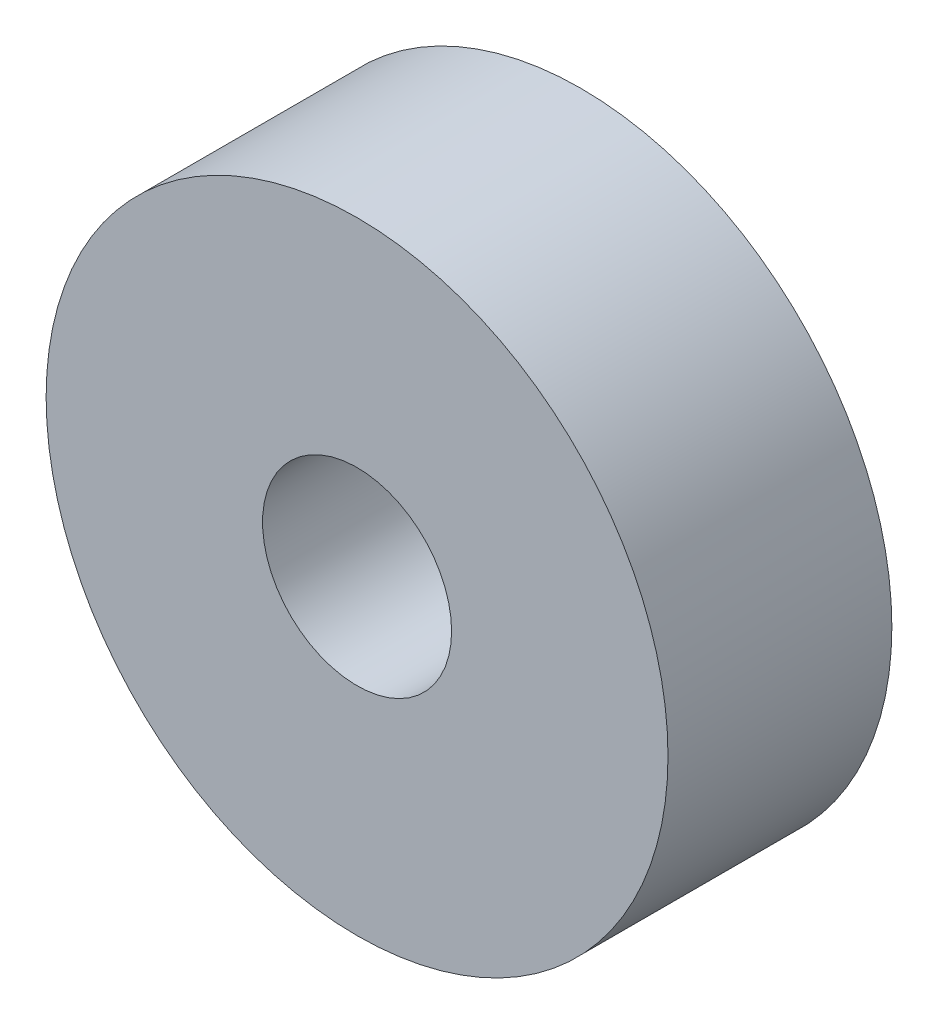
ISO-10303-21;
HEADER;
FILE_DESCRIPTION(('STEP AP214'),'2;1');
FILE_NAME('part.step','',(''),(''),'','','');
FILE_SCHEMA(('AUTOMOTIVE_DESIGN { 1 0 10303 214 1 1 1 1 }'));
ENDSEC;
DATA;
#1=APPLICATION_CONTEXT('core data for automotive mechanical design processes');
#2=APPLICATION_PROTOCOL_DEFINITION('international standard','automotive_design',2000,#1);
#3=PRODUCT_CONTEXT('',#1,'mechanical');
#4=PRODUCT('Part','Part','',(#3));
#5=PRODUCT_RELATED_PRODUCT_CATEGORY('part','',(#4));
#6=PRODUCT_DEFINITION_FORMATION('','',#4);
#7=PRODUCT_DEFINITION_CONTEXT('part definition',#1,'design');
#8=PRODUCT_DEFINITION('design','',#6,#7);
#9=PRODUCT_DEFINITION_SHAPE('','',#8);
#10=(LENGTH_UNIT() NAMED_UNIT(*) SI_UNIT(.MILLI.,.METRE.));
#11=(NAMED_UNIT(*) PLANE_ANGLE_UNIT() SI_UNIT($,.RADIAN.));
#12=(NAMED_UNIT(*) SI_UNIT($,.STERADIAN.) SOLID_ANGLE_UNIT());
#13=UNCERTAINTY_MEASURE_WITH_UNIT(LENGTH_MEASURE(1.E-05),#10,'distance_accuracy_value','');
#14=(GEOMETRIC_REPRESENTATION_CONTEXT(3) GLOBAL_UNCERTAINTY_ASSIGNED_CONTEXT((#13)) GLOBAL_UNIT_ASSIGNED_CONTEXT((#10,
#11,#12)) REPRESENTATION_CONTEXT('',''));
#15=CARTESIAN_POINT('',(0.,0.,0.));
#16=DIRECTION('',(0.,0.,1.));
#17=DIRECTION('',(1.,0.,0.));
#18=AXIS2_PLACEMENT_3D('',#15,#16,#17);
#19=CARTESIAN_POINT('',(0.,0.,9.));
#20=DIRECTION('',(0.,0.,-1.));
#21=DIRECTION('',(-1.,0.,0.));
#22=AXIS2_PLACEMENT_3D('',#19,#20,#21);
#23=CYLINDRICAL_SURFACE('',#22,12.5);
#24=CARTESIAN_POINT('',(0.,0.,9.));
#25=DIRECTION('',(0.,0.,1.));
#26=DIRECTION('',(1.,0.,0.));
#27=AXIS2_PLACEMENT_3D('',#24,#25,#26);
#28=CIRCLE('',#27,12.5);
#29=CARTESIAN_POINT('',(12.5,0.,9.));
#30=VERTEX_POINT('',#29);
#31=EDGE_CURVE('E10',#30,#30,#28,.T.);
#32=ORIENTED_EDGE('',*,*,#31,.F.);
#33=EDGE_LOOP('',(#32));
#34=FACE_BOUND('',#33,.T.);
#35=CARTESIAN_POINT('',(0.,0.,0.));
#36=DIRECTION('',(0.,0.,1.));
#37=DIRECTION('',(1.,0.,0.));
#38=AXIS2_PLACEMENT_3D('',#35,#36,#37);
#39=CIRCLE('',#38,12.5);
#40=CARTESIAN_POINT('',(12.5,0.,0.));
#41=VERTEX_POINT('',#40);
#42=EDGE_CURVE('E40',#41,#41,#39,.T.);
#43=ORIENTED_EDGE('',*,*,#42,.T.);
#44=EDGE_LOOP('',(#43));
#45=FACE_BOUND('',#44,.T.);
#46=ADVANCED_FACE('F37',(#34,#45),#23,.T.);
#47=CARTESIAN_POINT('',(0.,0.,9.));
#48=DIRECTION('',(0.,0.,1.));
#49=DIRECTION('',(1.,0.,0.));
#50=AXIS2_PLACEMENT_3D('',#47,#48,#49);
#51=PLANE('',#50);
#52=CARTESIAN_POINT('',(0.,0.,9.));
#53=DIRECTION('',(0.,0.,1.));
#54=DIRECTION('',(1.,0.,0.));
#55=AXIS2_PLACEMENT_3D('',#52,#53,#54);
#56=CIRCLE('',#55,3.8);
#57=CARTESIAN_POINT('',(3.8,0.,9.));
#58=VERTEX_POINT('',#57);
#59=EDGE_CURVE('E49',#58,#58,#56,.T.);
#60=ORIENTED_EDGE('',*,*,#59,.F.);
#61=EDGE_LOOP('',(#60));
#62=FACE_BOUND('',#61,.T.);
#63=ORIENTED_EDGE('',*,*,#31,.T.);
#64=EDGE_LOOP('',(#63));
#65=FACE_BOUND('',#64,.T.);
#66=ADVANCED_FACE('F64',(#62,#65),#51,.T.);
#67=CARTESIAN_POINT('',(0.,0.,0.));
#68=DIRECTION('',(0.,0.,1.));
#69=DIRECTION('',(1.,0.,0.));
#70=AXIS2_PLACEMENT_3D('',#67,#68,#69);
#71=PLANE('',#70);
#72=CARTESIAN_POINT('',(0.,0.,0.));
#73=DIRECTION('',(0.,0.,1.));
#74=DIRECTION('',(1.,0.,0.));
#75=AXIS2_PLACEMENT_3D('',#72,#73,#74);
#76=CIRCLE('',#75,3.8);
#77=CARTESIAN_POINT('',(3.8,0.,0.));
#78=VERTEX_POINT('',#77);
#79=EDGE_CURVE('E47',#78,#78,#76,.T.);
#80=ORIENTED_EDGE('',*,*,#79,.T.);
#81=EDGE_LOOP('',(#80));
#82=FACE_BOUND('',#81,.T.);
#83=ORIENTED_EDGE('',*,*,#42,.F.);
#84=EDGE_LOOP('',(#83));
#85=FACE_BOUND('',#84,.T.);
#86=ADVANCED_FACE('F55',(#82,#85),#71,.F.);
#87=CARTESIAN_POINT('',(0.,0.,0.));
#88=DIRECTION('',(0.,0.,1.));
#89=DIRECTION('',(1.,0.,0.));
#90=AXIS2_PLACEMENT_3D('',#87,#88,#89);
#91=CYLINDRICAL_SURFACE('',#90,3.8);
#92=ORIENTED_EDGE('',*,*,#79,.F.);
#93=EDGE_LOOP('',(#92));
#94=FACE_BOUND('',#93,.T.);
#95=ORIENTED_EDGE('',*,*,#59,.T.);
#96=EDGE_LOOP('',(#95));
#97=FACE_BOUND('',#96,.T.);
#98=ADVANCED_FACE('F58',(#94,#97),#91,.F.);
#99=CLOSED_SHELL('',(#46,#66,#86,#98));
#100=MANIFOLD_SOLID_BREP('B2',#99);
#101=ADVANCED_BREP_SHAPE_REPRESENTATION('',(#18,#100),#14);
#102=SHAPE_DEFINITION_REPRESENTATION(#9,#101);
ENDSEC;
END-ISO-10303-21;
